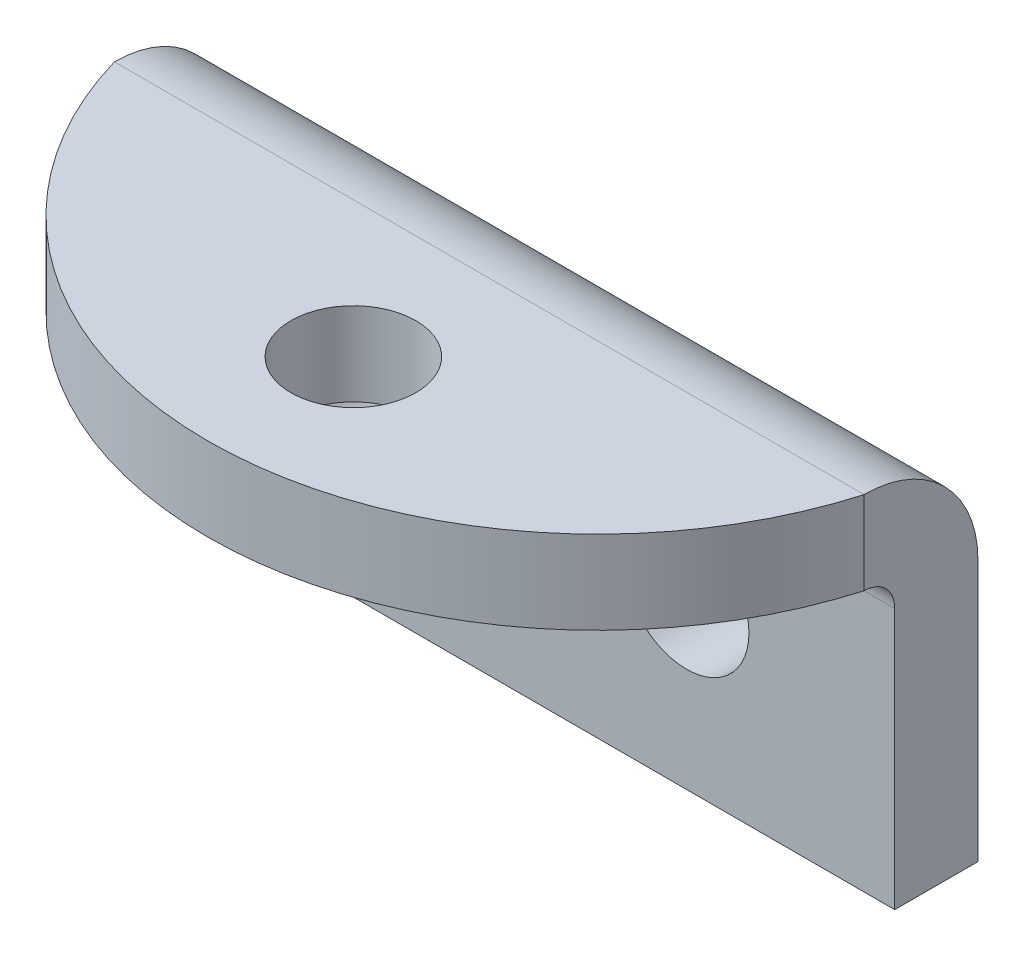
ISO-10303-21;
HEADER;
FILE_DESCRIPTION(('STEP AP214'),'2;1');
FILE_NAME('part.step','',(''),(''),'','','');
FILE_SCHEMA(('AUTOMOTIVE_DESIGN { 1 0 10303 214 1 1 1 1 }'));
ENDSEC;
DATA;
#1=APPLICATION_CONTEXT('core data for automotive mechanical design processes');
#2=APPLICATION_PROTOCOL_DEFINITION('international standard','automotive_design',2000,#1);
#3=PRODUCT_CONTEXT('',#1,'mechanical');
#4=PRODUCT('Part','Part','',(#3));
#5=PRODUCT_RELATED_PRODUCT_CATEGORY('part','',(#4));
#6=PRODUCT_DEFINITION_FORMATION('','',#4);
#7=PRODUCT_DEFINITION_CONTEXT('part definition',#1,'design');
#8=PRODUCT_DEFINITION('design','',#6,#7);
#9=PRODUCT_DEFINITION_SHAPE('','',#8);
#10=(LENGTH_UNIT() NAMED_UNIT(*) SI_UNIT(.MILLI.,.METRE.));
#11=(NAMED_UNIT(*) PLANE_ANGLE_UNIT() SI_UNIT($,.RADIAN.));
#12=(NAMED_UNIT(*) SI_UNIT($,.STERADIAN.) SOLID_ANGLE_UNIT());
#13=UNCERTAINTY_MEASURE_WITH_UNIT(LENGTH_MEASURE(1.E-05),#10,'distance_accuracy_value','');
#14=(GEOMETRIC_REPRESENTATION_CONTEXT(3) GLOBAL_UNCERTAINTY_ASSIGNED_CONTEXT((#13)) GLOBAL_UNIT_ASSIGNED_CONTEXT((#10,
#11,#12)) REPRESENTATION_CONTEXT('',''));
#15=CARTESIAN_POINT('',(0.,0.,0.));
#16=DIRECTION('',(0.,0.,1.));
#17=DIRECTION('',(1.,0.,0.));
#18=AXIS2_PLACEMENT_3D('',#15,#16,#17);
#19=CARTESIAN_POINT('',(0.,0.,0.));
#20=DIRECTION('',(0.,-1.,0.));
#21=DIRECTION('',(0.,0.,-1.));
#22=AXIS2_PLACEMENT_3D('',#19,#20,#21);
#23=PLANE('',#22);
#24=CARTESIAN_POINT('',(8.99999999999999,0.,4.));
#25=DIRECTION('',(0.,-1.,0.));
#26=DIRECTION('',(0.,0.,-1.));
#27=AXIS2_PLACEMENT_3D('',#24,#25,#26);
#28=CIRCLE('',#27,1.5);
#29=CARTESIAN_POINT('',(8.99999999999999,0.,2.5));
#30=VERTEX_POINT('',#29);
#31=EDGE_CURVE('E20',#30,#30,#28,.T.);
#32=ORIENTED_EDGE('',*,*,#31,.T.);
#33=EDGE_LOOP('',(#32));
#34=FACE_BOUND('',#33,.T.);
#35=DIRECTION('',(-1.,0.,0.));
#36=VECTOR('',#35,1.);
#37=CARTESIAN_POINT('',(0.,0.,0.736599999999976));
#38=LINE('',#37,#36);
#39=CARTESIAN_POINT('',(0.,0.,0.736599999999976));
#40=VERTEX_POINT('',#39);
#41=CARTESIAN_POINT('',(18.,0.,0.736599999999987));
#42=VERTEX_POINT('',#41);
#43=EDGE_CURVE('E70',#40,#42,#38,.F.);
#44=ORIENTED_EDGE('',*,*,#43,.F.);
#45=CARTESIAN_POINT('',(8.99999999999999,0.,-1.86981248780202));
#46=DIRECTION('',(0.,-1.,0.));
#47=DIRECTION('',(0.,0.,-1.));
#48=AXIS2_PLACEMENT_3D('',#45,#46,#47);
#49=CIRCLE('',#48,9.369812487802);
#50=EDGE_CURVE('E67',#42,#40,#49,.T.);
#51=ORIENTED_EDGE('',*,*,#50,.F.);
#52=EDGE_LOOP('',(#44,#51));
#53=FACE_BOUND('',#52,.T.);
#54=ADVANCED_FACE('F17',(#34,#53),#23,.F.);
#55=CARTESIAN_POINT('',(8.99999999999999,-2.,4.));
#56=DIRECTION('',(0.,-1.,0.));
#57=DIRECTION('',(0.,0.,-1.));
#58=AXIS2_PLACEMENT_3D('',#55,#56,#57);
#59=CYLINDRICAL_SURFACE('',#58,1.5);
#60=CARTESIAN_POINT('',(8.99999999999999,-2.,4.));
#61=DIRECTION('',(0.,-1.,0.));
#62=DIRECTION('',(0.,0.,-1.));
#63=AXIS2_PLACEMENT_3D('',#60,#61,#62);
#64=CIRCLE('',#63,1.5);
#65=CARTESIAN_POINT('',(8.99999999999999,-2.00000000000001,2.50000000000001));
#66=VERTEX_POINT('',#65);
#67=EDGE_CURVE('E96',#66,#66,#64,.F.);
#68=ORIENTED_EDGE('',*,*,#67,.F.);
#69=EDGE_LOOP('',(#68));
#70=FACE_BOUND('',#69,.T.);
#71=ORIENTED_EDGE('',*,*,#31,.F.);
#72=EDGE_LOOP('',(#71));
#73=FACE_BOUND('',#72,.T.);
#74=ADVANCED_FACE('F247',(#70,#73),#59,.F.);
#75=CARTESIAN_POINT('',(8.99999999999999,0.,-1.86981248780202));
#76=DIRECTION('',(0.,-1.,0.));
#77=DIRECTION('',(0.,0.,-1.));
#78=AXIS2_PLACEMENT_3D('',#75,#76,#77);
#79=CYLINDRICAL_SURFACE('',#78,9.369812487802);
#80=DIRECTION('',(0.,1.,0.));
#81=VECTOR('',#80,1.);
#82=CARTESIAN_POINT('',(0.,-2.73660000000003,0.736599999999976));
#83=LINE('',#82,#81);
#84=CARTESIAN_POINT('',(0.,-2.00000000000002,0.736599999999997));
#85=VERTEX_POINT('',#84);
#86=EDGE_CURVE('E103',#40,#85,#83,.F.);
#87=ORIENTED_EDGE('',*,*,#86,.T.);
#88=CARTESIAN_POINT('',(8.99999999999999,-2.00000000000001,-1.86981248780201));
#89=DIRECTION('',(0.,-1.,0.));
#90=DIRECTION('',(0.,0.,-1.));
#91=AXIS2_PLACEMENT_3D('',#88,#89,#90);
#92=CIRCLE('',#91,9.369812487802);
#93=CARTESIAN_POINT('',(18.,-2.00000000000002,0.736600000000004));
#94=VERTEX_POINT('',#93);
#95=EDGE_CURVE('E79',#94,#85,#92,.T.);
#96=ORIENTED_EDGE('',*,*,#95,.F.);
#97=DIRECTION('',(0.,1.,0.));
#98=VECTOR('',#97,1.);
#99=CARTESIAN_POINT('',(18.,-2.73660000000003,0.73659999999999));
#100=LINE('',#99,#98);
#101=EDGE_CURVE('E76',#42,#94,#100,.F.);
#102=ORIENTED_EDGE('',*,*,#101,.F.);
#103=ORIENTED_EDGE('',*,*,#50,.T.);
#104=EDGE_LOOP('',(#87,#96,#102,#103));
#105=FACE_BOUND('',#104,.T.);
#106=ADVANCED_FACE('F77',(#105),#79,.T.);
#107=CARTESIAN_POINT('',(0.,-2.73660000000003,0.736600000000018));
#108=DIRECTION('',(-1.,0.,0.));
#109=DIRECTION('',(0.,0.,1.));
#110=AXIS2_PLACEMENT_3D('',#107,#108,#109);
#111=CYLINDRICAL_SURFACE('',#110,2.7366);
#112=ORIENTED_EDGE('',*,*,#43,.T.);
#113=CARTESIAN_POINT('',(18.,-2.73660000000003,0.736600000000018));
#114=DIRECTION('',(-1.,0.,0.));
#115=DIRECTION('',(0.,0.,1.));
#116=AXIS2_PLACEMENT_3D('',#113,#114,#115);
#117=CIRCLE('',#116,2.7366);
#118=CARTESIAN_POINT('',(18.,-2.73660000000001,-1.99999999999999));
#119=VERTEX_POINT('',#118);
#120=EDGE_CURVE('E86',#119,#42,#117,.F.);
#121=ORIENTED_EDGE('',*,*,#120,.F.);
#122=DIRECTION('',(1.,0.,0.));
#123=VECTOR('',#122,1.);
#124=CARTESIAN_POINT('',(0.,-2.73659999999998,-1.99999999999999));
#125=LINE('',#124,#123);
#126=CARTESIAN_POINT('',(0.,-2.73660000000001,-1.99999999999999));
#127=VERTEX_POINT('',#126);
#128=EDGE_CURVE('E108',#119,#127,#125,.F.);
#129=ORIENTED_EDGE('',*,*,#128,.T.);
#130=CARTESIAN_POINT('',(0.,-2.73660000000003,0.736600000000018));
#131=DIRECTION('',(-1.,0.,0.));
#132=DIRECTION('',(0.,0.,1.));
#133=AXIS2_PLACEMENT_3D('',#130,#131,#132);
#134=CIRCLE('',#133,2.7366);
#135=EDGE_CURVE('E89',#127,#40,#134,.F.);
#136=ORIENTED_EDGE('',*,*,#135,.T.);
#137=EDGE_LOOP('',(#112,#121,#129,#136));
#138=FACE_BOUND('',#137,.T.);
#139=ADVANCED_FACE('F85',(#138),#111,.T.);
#140=CARTESIAN_POINT('',(0.,-2.00000000000006,0.));
#141=DIRECTION('',(0.,-1.,0.));
#142=DIRECTION('',(0.,0.,-1.));
#143=AXIS2_PLACEMENT_3D('',#140,#141,#142);
#144=PLANE('',#143);
#145=ORIENTED_EDGE('',*,*,#67,.T.);
#146=EDGE_LOOP('',(#145));
#147=FACE_BOUND('',#146,.T.);
#148=DIRECTION('',(-1.,0.,0.));
#149=VECTOR('',#148,1.);
#150=CARTESIAN_POINT('',(0.,-2.00000000000003,0.736600000000018));
#151=LINE('',#150,#149);
#152=EDGE_CURVE('E114',#85,#94,#151,.F.);
#153=ORIENTED_EDGE('',*,*,#152,.T.);
#154=ORIENTED_EDGE('',*,*,#95,.T.);
#155=EDGE_LOOP('',(#153,#154));
#156=FACE_BOUND('',#155,.T.);
#157=ADVANCED_FACE('F153',(#147,#156),#144,.T.);
#158=CARTESIAN_POINT('',(0.,0.,-1.99999999999999));
#159=DIRECTION('',(0.,0.,1.));
#160=DIRECTION('',(1.,0.,0.));
#161=AXIS2_PLACEMENT_3D('',#158,#159,#160);
#162=PLANE('',#161);
#163=DIRECTION('',(0.,1.,0.));
#164=VECTOR('',#163,1.);
#165=CARTESIAN_POINT('',(18.,0.,-2.));
#166=LINE('',#165,#164);
#167=CARTESIAN_POINT('',(18.,-9.00000000000001,-1.99999999999999));
#168=VERTEX_POINT('',#167);
#169=EDGE_CURVE('E94',#168,#119,#166,.T.);
#170=ORIENTED_EDGE('',*,*,#169,.F.);
#171=DIRECTION('',(1.,0.,0.));
#172=VECTOR('',#171,1.);
#173=CARTESIAN_POINT('',(0.,-9.00000000000001,-1.99999999999999));
#174=LINE('',#173,#172);
#175=CARTESIAN_POINT('',(0.,-9.00000000000001,-1.99999999999999));
#176=VERTEX_POINT('',#175);
#177=EDGE_CURVE('E138',#176,#168,#174,.T.);
#178=ORIENTED_EDGE('',*,*,#177,.F.);
#179=DIRECTION('',(0.,-1.,0.));
#180=VECTOR('',#179,1.);
#181=CARTESIAN_POINT('',(0.,0.,-1.99999999999999));
#182=LINE('',#181,#180);
#183=EDGE_CURVE('E129',#127,#176,#182,.T.);
#184=ORIENTED_EDGE('',*,*,#183,.F.);
#185=ORIENTED_EDGE('',*,*,#128,.F.);
#186=EDGE_LOOP('',(#170,#178,#184,#185));
#187=FACE_BOUND('',#186,.T.);
#188=CARTESIAN_POINT('',(13.,-4.99999999999995,-2.));
#189=DIRECTION('',(0.,0.,1.));
#190=DIRECTION('',(1.,0.,0.));
#191=AXIS2_PLACEMENT_3D('',#188,#189,#190);
#192=CIRCLE('',#191,1.5);
#193=CARTESIAN_POINT('',(14.5,-4.99999999999995,-2.));
#194=VERTEX_POINT('',#193);
#195=EDGE_CURVE('E107',#194,#194,#192,.T.);
#196=ORIENTED_EDGE('',*,*,#195,.T.);
#197=EDGE_LOOP('',(#196));
#198=FACE_BOUND('',#197,.T.);
#199=CARTESIAN_POINT('',(4.99999999999998,-5.,-1.99999999999999));
#200=DIRECTION('',(0.,0.,1.));
#201=DIRECTION('',(1.,0.,0.));
#202=AXIS2_PLACEMENT_3D('',#199,#200,#201);
#203=CIRCLE('',#202,1.5);
#204=CARTESIAN_POINT('',(6.49999999999998,-5.,-1.99999999999999));
#205=VERTEX_POINT('',#204);
#206=EDGE_CURVE('E104',#205,#205,#203,.T.);
#207=ORIENTED_EDGE('',*,*,#206,.T.);
#208=EDGE_LOOP('',(#207));
#209=FACE_BOUND('',#208,.T.);
#210=ADVANCED_FACE('F211',(#187,#198,#209),#162,.F.);
#211=CARTESIAN_POINT('',(4.99999999999998,-5.,-1.99999999999999));
#212=DIRECTION('',(0.,0.,1.));
#213=DIRECTION('',(1.,0.,0.));
#214=AXIS2_PLACEMENT_3D('',#211,#212,#213);
#215=CYLINDRICAL_SURFACE('',#214,1.5);
#216=CARTESIAN_POINT('',(4.99999999999998,-5.,0.));
#217=DIRECTION('',(0.,0.,1.));
#218=DIRECTION('',(1.,0.,0.));
#219=AXIS2_PLACEMENT_3D('',#216,#217,#218);
#220=CIRCLE('',#219,1.5);
#221=CARTESIAN_POINT('',(6.49999999999998,-5.,0.));
#222=VERTEX_POINT('',#221);
#223=EDGE_CURVE('E115',#222,#222,#220,.F.);
#224=ORIENTED_EDGE('',*,*,#223,.F.);
#225=EDGE_LOOP('',(#224));
#226=FACE_BOUND('',#225,.T.);
#227=ORIENTED_EDGE('',*,*,#206,.F.);
#228=EDGE_LOOP('',(#227));
#229=FACE_BOUND('',#228,.T.);
#230=ADVANCED_FACE('F201',(#226,#229),#215,.F.);
#231=CARTESIAN_POINT('',(13.,-4.99999999999995,-2.));
#232=DIRECTION('',(0.,0.,1.));
#233=DIRECTION('',(1.,0.,0.));
#234=AXIS2_PLACEMENT_3D('',#231,#232,#233);
#235=CYLINDRICAL_SURFACE('',#234,1.5);
#236=CARTESIAN_POINT('',(13.,-4.99999999999995,0.));
#237=DIRECTION('',(0.,0.,1.));
#238=DIRECTION('',(1.,0.,0.));
#239=AXIS2_PLACEMENT_3D('',#236,#237,#238);
#240=CIRCLE('',#239,1.5);
#241=CARTESIAN_POINT('',(14.5,-4.99999999999995,0.));
#242=VERTEX_POINT('',#241);
#243=EDGE_CURVE('E118',#242,#242,#240,.F.);
#244=ORIENTED_EDGE('',*,*,#243,.F.);
#245=EDGE_LOOP('',(#244));
#246=FACE_BOUND('',#245,.T.);
#247=ORIENTED_EDGE('',*,*,#195,.F.);
#248=EDGE_LOOP('',(#247));
#249=FACE_BOUND('',#248,.T.);
#250=ADVANCED_FACE('F163',(#246,#249),#235,.F.);
#251=CARTESIAN_POINT('',(18.,0.,-2.));
#252=DIRECTION('',(1.,0.,0.));
#253=DIRECTION('',(0.,0.,-1.));
#254=AXIS2_PLACEMENT_3D('',#251,#252,#253);
#255=PLANE('',#254);
#256=DIRECTION('',(0.,0.,-1.));
#257=VECTOR('',#256,1.);
#258=CARTESIAN_POINT('',(18.,-9.00000000000001,-1.99999999999999));
#259=LINE('',#258,#257);
#260=CARTESIAN_POINT('',(18.,-9.00000000000001,0.));
#261=VERTEX_POINT('',#260);
#262=EDGE_CURVE('E119',#168,#261,#259,.F.);
#263=ORIENTED_EDGE('',*,*,#262,.F.);
#264=ORIENTED_EDGE('',*,*,#169,.T.);
#265=ORIENTED_EDGE('',*,*,#120,.T.);
#266=ORIENTED_EDGE('',*,*,#101,.T.);
#267=CARTESIAN_POINT('',(18.,-2.73660000000003,0.736600000000018));
#268=DIRECTION('',(-1.,0.,0.));
#269=DIRECTION('',(0.,0.,1.));
#270=AXIS2_PLACEMENT_3D('',#267,#268,#269);
#271=CIRCLE('',#270,0.7366);
#272=CARTESIAN_POINT('',(18.,-2.73660000000001,0.));
#273=VERTEX_POINT('',#272);
#274=EDGE_CURVE('E82',#94,#273,#271,.T.);
#275=ORIENTED_EDGE('',*,*,#274,.T.);
#276=DIRECTION('',(0.,1.,0.));
#277=VECTOR('',#276,1.);
#278=CARTESIAN_POINT('',(18.,0.,0.));
#279=LINE('',#278,#277);
#280=EDGE_CURVE('E121',#261,#273,#279,.T.);
#281=ORIENTED_EDGE('',*,*,#280,.F.);
#282=EDGE_LOOP('',(#263,#264,#265,#266,#275,#281));
#283=FACE_BOUND('',#282,.T.);
#284=ADVANCED_FACE('F93',(#283),#255,.T.);
#285=CARTESIAN_POINT('',(0.,-2.73660000000003,0.736600000000018));
#286=DIRECTION('',(-1.,0.,0.));
#287=DIRECTION('',(0.,0.,1.));
#288=AXIS2_PLACEMENT_3D('',#285,#286,#287);
#289=CYLINDRICAL_SURFACE('',#288,0.7366);
#290=ORIENTED_EDGE('',*,*,#274,.F.);
#291=ORIENTED_EDGE('',*,*,#152,.F.);
#292=CARTESIAN_POINT('',(0.,-2.73660000000003,0.736600000000018));
#293=DIRECTION('',(-1.,0.,0.));
#294=DIRECTION('',(0.,0.,1.));
#295=AXIS2_PLACEMENT_3D('',#292,#293,#294);
#296=CIRCLE('',#295,0.7366);
#297=CARTESIAN_POINT('',(0.,-2.73660000000001,0.));
#298=VERTEX_POINT('',#297);
#299=EDGE_CURVE('E111',#298,#85,#296,.F.);
#300=ORIENTED_EDGE('',*,*,#299,.F.);
#301=DIRECTION('',(1.,0.,0.));
#302=VECTOR('',#301,1.);
#303=CARTESIAN_POINT('',(0.,-2.73659999999998,0.));
#304=LINE('',#303,#302);
#305=EDGE_CURVE('E125',#273,#298,#304,.F.);
#306=ORIENTED_EDGE('',*,*,#305,.F.);
#307=EDGE_LOOP('',(#290,#291,#300,#306));
#308=FACE_BOUND('',#307,.T.);
#309=ADVANCED_FACE('F154',(#308),#289,.F.);
#310=CARTESIAN_POINT('',(0.,0.,-1.99999999999999));
#311=DIRECTION('',(-1.,0.,0.));
#312=DIRECTION('',(0.,-1.,0.));
#313=AXIS2_PLACEMENT_3D('',#310,#311,#312);
#314=PLANE('',#313);
#315=ORIENTED_EDGE('',*,*,#183,.T.);
#316=DIRECTION('',(0.,0.,-1.));
#317=VECTOR('',#316,1.);
#318=CARTESIAN_POINT('',(0.,-9.00000000000001,-1.99999999999999));
#319=LINE('',#318,#317);
#320=CARTESIAN_POINT('',(0.,-9.00000000000001,0.));
#321=VERTEX_POINT('',#320);
#322=EDGE_CURVE('E35',#321,#176,#319,.T.);
#323=ORIENTED_EDGE('',*,*,#322,.F.);
#324=DIRECTION('',(0.,1.,0.));
#325=VECTOR('',#324,1.);
#326=CARTESIAN_POINT('',(0.,0.,0.));
#327=LINE('',#326,#325);
#328=EDGE_CURVE('E26',#298,#321,#327,.F.);
#329=ORIENTED_EDGE('',*,*,#328,.F.);
#330=ORIENTED_EDGE('',*,*,#299,.T.);
#331=ORIENTED_EDGE('',*,*,#86,.F.);
#332=ORIENTED_EDGE('',*,*,#135,.F.);
#333=EDGE_LOOP('',(#315,#323,#329,#330,#331,#332));
#334=FACE_BOUND('',#333,.T.);
#335=ADVANCED_FACE('F149',(#334),#314,.T.);
#336=CARTESIAN_POINT('',(0.,-9.00000000000001,-1.99999999999999));
#337=DIRECTION('',(0.,-1.,0.));
#338=DIRECTION('',(0.,0.,-1.));
#339=AXIS2_PLACEMENT_3D('',#336,#337,#338);
#340=PLANE('',#339);
#341=ORIENTED_EDGE('',*,*,#177,.T.);
#342=ORIENTED_EDGE('',*,*,#262,.T.);
#343=DIRECTION('',(1.,0.,0.));
#344=VECTOR('',#343,1.);
#345=CARTESIAN_POINT('',(0.,-9.00000000000001,0.));
#346=LINE('',#345,#344);
#347=EDGE_CURVE('E11',#321,#261,#346,.T.);
#348=ORIENTED_EDGE('',*,*,#347,.F.);
#349=ORIENTED_EDGE('',*,*,#322,.T.);
#350=EDGE_LOOP('',(#341,#342,#348,#349));
#351=FACE_BOUND('',#350,.T.);
#352=ADVANCED_FACE('F143',(#351),#340,.T.);
#353=CARTESIAN_POINT('',(0.,0.,0.));
#354=DIRECTION('',(0.,0.,1.));
#355=DIRECTION('',(1.,0.,0.));
#356=AXIS2_PLACEMENT_3D('',#353,#354,#355);
#357=PLANE('',#356);
#358=ORIENTED_EDGE('',*,*,#328,.T.);
#359=ORIENTED_EDGE('',*,*,#347,.T.);
#360=ORIENTED_EDGE('',*,*,#280,.T.);
#361=ORIENTED_EDGE('',*,*,#305,.T.);
#362=EDGE_LOOP('',(#358,#359,#360,#361));
#363=FACE_BOUND('',#362,.T.);
#364=ORIENTED_EDGE('',*,*,#243,.T.);
#365=EDGE_LOOP('',(#364));
#366=FACE_BOUND('',#365,.T.);
#367=ORIENTED_EDGE('',*,*,#223,.T.);
#368=EDGE_LOOP('',(#367));
#369=FACE_BOUND('',#368,.T.);
#370=ADVANCED_FACE('F146',(#363,#366,#369),#357,.T.);
#371=CLOSED_SHELL('',(#54,#74,#106,#139,#157,#210,#230,#250,#284,#309,#335,#352,#370));
#372=MANIFOLD_SOLID_BREP('B1',#371);
#373=ADVANCED_BREP_SHAPE_REPRESENTATION('',(#18,#372),#14);
#374=SHAPE_DEFINITION_REPRESENTATION(#9,#373);
ENDSEC;
END-ISO-10303-21;
